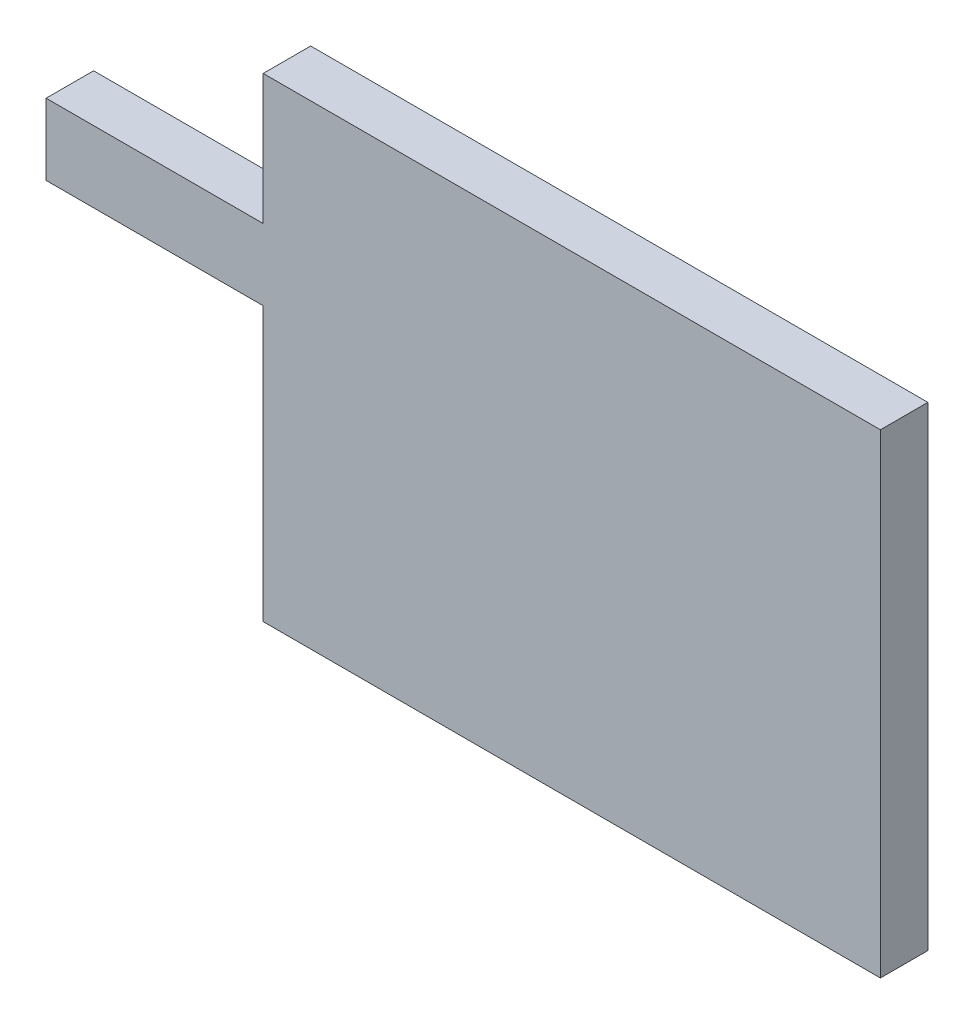
ISO-10303-21;
HEADER;
FILE_DESCRIPTION(('STEP AP214'),'2;1');
FILE_NAME('part.step','',(''),(''),'','','');
FILE_SCHEMA(('AUTOMOTIVE_DESIGN { 1 0 10303 214 1 1 1 1 }'));
ENDSEC;
DATA;
#1=APPLICATION_CONTEXT('core data for automotive mechanical design processes');
#2=APPLICATION_PROTOCOL_DEFINITION('international standard','automotive_design',2000,#1);
#3=PRODUCT_CONTEXT('',#1,'mechanical');
#4=PRODUCT('Part','Part','',(#3));
#5=PRODUCT_RELATED_PRODUCT_CATEGORY('part','',(#4));
#6=PRODUCT_DEFINITION_FORMATION('','',#4);
#7=PRODUCT_DEFINITION_CONTEXT('part definition',#1,'design');
#8=PRODUCT_DEFINITION('design','',#6,#7);
#9=PRODUCT_DEFINITION_SHAPE('','',#8);
#10=(LENGTH_UNIT() NAMED_UNIT(*) SI_UNIT(.MILLI.,.METRE.));
#11=(NAMED_UNIT(*) PLANE_ANGLE_UNIT() SI_UNIT($,.RADIAN.));
#12=(NAMED_UNIT(*) SI_UNIT($,.STERADIAN.) SOLID_ANGLE_UNIT());
#13=UNCERTAINTY_MEASURE_WITH_UNIT(LENGTH_MEASURE(1.E-05),#10,'distance_accuracy_value','');
#14=(GEOMETRIC_REPRESENTATION_CONTEXT(3) GLOBAL_UNCERTAINTY_ASSIGNED_CONTEXT((#13)) GLOBAL_UNIT_ASSIGNED_CONTEXT((#10,
#11,#12)) REPRESENTATION_CONTEXT('',''));
#15=CARTESIAN_POINT('',(0.,0.,0.));
#16=DIRECTION('',(0.,0.,1.));
#17=DIRECTION('',(1.,0.,0.));
#18=AXIS2_PLACEMENT_3D('',#15,#16,#17);
#19=CARTESIAN_POINT('',(-105.501188116584,45.1195608729233,10.));
#20=DIRECTION('',(1.,0.,0.));
#21=DIRECTION('',(0.,1.,0.));
#22=AXIS2_PLACEMENT_3D('',#19,#20,#21);
#23=PLANE('',#22);
#24=DIRECTION('',(0.,-1.,0.));
#25=VECTOR('',#24,1.);
#26=CARTESIAN_POINT('',(-105.501188116584,45.1195608729233,0.));
#27=LINE('',#26,#25);
#28=CARTESIAN_POINT('',(-105.501188116584,45.1195608729233,0.));
#29=VERTEX_POINT('',#28);
#30=CARTESIAN_POINT('',(-105.501188116584,17.7395608729233,0.));
#31=VERTEX_POINT('',#30);
#32=EDGE_CURVE('E129',#29,#31,#27,.T.);
#33=ORIENTED_EDGE('',*,*,#32,.T.);
#34=DIRECTION('',(0.,0.,-1.));
#35=VECTOR('',#34,1.);
#36=CARTESIAN_POINT('',(-105.501188116584,17.7395608729233,10.));
#37=LINE('',#36,#35);
#38=CARTESIAN_POINT('',(-105.501188116584,17.7395608729233,10.));
#39=VERTEX_POINT('',#38);
#40=EDGE_CURVE('E11',#39,#31,#37,.T.);
#41=ORIENTED_EDGE('',*,*,#40,.F.);
#42=DIRECTION('',(0.,-1.,0.));
#43=VECTOR('',#42,1.);
#44=CARTESIAN_POINT('',(-105.501188116584,45.1195608729233,10.));
#45=LINE('',#44,#43);
#46=CARTESIAN_POINT('',(-105.501188116584,45.1195608729233,10.));
#47=VERTEX_POINT('',#46);
#48=EDGE_CURVE('E143',#47,#39,#45,.T.);
#49=ORIENTED_EDGE('',*,*,#48,.F.);
#50=DIRECTION('',(0.,0.,-1.));
#51=VECTOR('',#50,1.);
#52=CARTESIAN_POINT('',(-105.501188116584,45.1195608729233,10.));
#53=LINE('',#52,#51);
#54=EDGE_CURVE('E125',#47,#29,#53,.T.);
#55=ORIENTED_EDGE('',*,*,#54,.T.);
#56=EDGE_LOOP('',(#33,#41,#49,#55));
#57=FACE_BOUND('',#56,.T.);
#58=ADVANCED_FACE('F33',(#57),#23,.F.);
#59=CARTESIAN_POINT('',(-151.221188116584,17.7395608729233,10.));
#60=DIRECTION('',(0.,-1.,0.));
#61=DIRECTION('',(0.,0.,-1.));
#62=AXIS2_PLACEMENT_3D('',#59,#60,#61);
#63=PLANE('',#62);
#64=DIRECTION('',(-1.,0.,0.));
#65=VECTOR('',#64,1.);
#66=CARTESIAN_POINT('',(-151.221188116584,17.7395608729233,0.));
#67=LINE('',#66,#65);
#68=CARTESIAN_POINT('',(-151.221188116584,17.7395608729233,0.));
#69=VERTEX_POINT('',#68);
#70=EDGE_CURVE('E132',#31,#69,#67,.T.);
#71=ORIENTED_EDGE('',*,*,#70,.T.);
#72=DIRECTION('',(0.,0.,-1.));
#73=VECTOR('',#72,1.);
#74=CARTESIAN_POINT('',(-151.221188116584,17.7395608729233,10.));
#75=LINE('',#74,#73);
#76=CARTESIAN_POINT('',(-151.221188116584,17.7395608729233,10.));
#77=VERTEX_POINT('',#76);
#78=EDGE_CURVE('E41',#77,#69,#75,.T.);
#79=ORIENTED_EDGE('',*,*,#78,.F.);
#80=DIRECTION('',(-1.,0.,0.));
#81=VECTOR('',#80,1.);
#82=CARTESIAN_POINT('',(-151.221188116584,17.7395608729233,10.));
#83=LINE('',#82,#81);
#84=EDGE_CURVE('E92',#39,#77,#83,.T.);
#85=ORIENTED_EDGE('',*,*,#84,.F.);
#86=ORIENTED_EDGE('',*,*,#40,.T.);
#87=EDGE_LOOP('',(#71,#79,#85,#86));
#88=FACE_BOUND('',#87,.T.);
#89=ADVANCED_FACE('F178',(#88),#63,.F.);
#90=CARTESIAN_POINT('',(-151.221188116584,17.7395608729233,10.));
#91=DIRECTION('',(1.,0.,0.));
#92=DIRECTION('',(0.,0.,-1.));
#93=AXIS2_PLACEMENT_3D('',#90,#91,#92);
#94=PLANE('',#93);
#95=DIRECTION('',(0.,-1.,0.));
#96=VECTOR('',#95,1.);
#97=CARTESIAN_POINT('',(-151.221188116584,17.7395608729233,0.));
#98=LINE('',#97,#96);
#99=CARTESIAN_POINT('',(-151.221188116584,2.73956087292333,0.));
#100=VERTEX_POINT('',#99);
#101=EDGE_CURVE('E134',#69,#100,#98,.T.);
#102=ORIENTED_EDGE('',*,*,#101,.T.);
#103=DIRECTION('',(0.,0.,-1.));
#104=VECTOR('',#103,1.);
#105=CARTESIAN_POINT('',(-151.221188116584,2.73956087292333,10.));
#106=LINE('',#105,#104);
#107=CARTESIAN_POINT('',(-151.221188116584,2.73956087292333,10.));
#108=VERTEX_POINT('',#107);
#109=EDGE_CURVE('E150',#108,#100,#106,.T.);
#110=ORIENTED_EDGE('',*,*,#109,.F.);
#111=DIRECTION('',(0.,-1.,0.));
#112=VECTOR('',#111,1.);
#113=CARTESIAN_POINT('',(-151.221188116584,17.7395608729233,10.));
#114=LINE('',#113,#112);
#115=EDGE_CURVE('E158',#77,#108,#114,.T.);
#116=ORIENTED_EDGE('',*,*,#115,.F.);
#117=ORIENTED_EDGE('',*,*,#78,.T.);
#118=EDGE_LOOP('',(#102,#110,#116,#117));
#119=FACE_BOUND('',#118,.T.);
#120=ADVANCED_FACE('F156',(#119),#94,.F.);
#121=CARTESIAN_POINT('',(-151.221188116584,2.73956087292333,10.));
#122=DIRECTION('',(0.,1.,0.));
#123=DIRECTION('',(0.,0.,1.));
#124=AXIS2_PLACEMENT_3D('',#121,#122,#123);
#125=PLANE('',#124);
#126=DIRECTION('',(1.,0.,0.));
#127=VECTOR('',#126,1.);
#128=CARTESIAN_POINT('',(-151.221188116584,2.73956087292333,0.));
#129=LINE('',#128,#127);
#130=CARTESIAN_POINT('',(-105.501188116584,2.73956087292333,0.));
#131=VERTEX_POINT('',#130);
#132=EDGE_CURVE('E136',#100,#131,#129,.T.);
#133=ORIENTED_EDGE('',*,*,#132,.T.);
#134=DIRECTION('',(0.,0.,-1.));
#135=VECTOR('',#134,1.);
#136=CARTESIAN_POINT('',(-105.501188116584,2.73956087292333,10.));
#137=LINE('',#136,#135);
#138=CARTESIAN_POINT('',(-105.501188116584,2.73956087292333,10.));
#139=VERTEX_POINT('',#138);
#140=EDGE_CURVE('E147',#139,#131,#137,.T.);
#141=ORIENTED_EDGE('',*,*,#140,.F.);
#142=DIRECTION('',(1.,0.,0.));
#143=VECTOR('',#142,1.);
#144=CARTESIAN_POINT('',(-151.221188116584,2.73956087292333,10.));
#145=LINE('',#144,#143);
#146=EDGE_CURVE('E170',#108,#139,#145,.T.);
#147=ORIENTED_EDGE('',*,*,#146,.F.);
#148=ORIENTED_EDGE('',*,*,#109,.T.);
#149=EDGE_LOOP('',(#133,#141,#147,#148));
#150=FACE_BOUND('',#149,.T.);
#151=ADVANCED_FACE('F166',(#150),#125,.F.);
#152=CARTESIAN_POINT('',(-105.501188116584,2.73956087292333,10.));
#153=DIRECTION('',(1.,0.,0.));
#154=DIRECTION('',(0.,1.,0.));
#155=AXIS2_PLACEMENT_3D('',#152,#153,#154);
#156=PLANE('',#155);
#157=DIRECTION('',(0.,-1.,0.));
#158=VECTOR('',#157,1.);
#159=CARTESIAN_POINT('',(-105.501188116584,2.73956087292333,0.));
#160=LINE('',#159,#158);
#161=CARTESIAN_POINT('',(-105.501188116584,-54.8804391270767,0.));
#162=VERTEX_POINT('',#161);
#163=EDGE_CURVE('E138',#131,#162,#160,.T.);
#164=ORIENTED_EDGE('',*,*,#163,.T.);
#165=DIRECTION('',(0.,0.,-1.));
#166=VECTOR('',#165,1.);
#167=CARTESIAN_POINT('',(-105.501188116584,-54.8804391270767,10.));
#168=LINE('',#167,#166);
#169=CARTESIAN_POINT('',(-105.501188116584,-54.8804391270767,10.));
#170=VERTEX_POINT('',#169);
#171=EDGE_CURVE('E120',#170,#162,#168,.T.);
#172=ORIENTED_EDGE('',*,*,#171,.F.);
#173=DIRECTION('',(0.,-1.,0.));
#174=VECTOR('',#173,1.);
#175=CARTESIAN_POINT('',(-105.501188116584,2.73956087292333,10.));
#176=LINE('',#175,#174);
#177=EDGE_CURVE('E111',#139,#170,#176,.T.);
#178=ORIENTED_EDGE('',*,*,#177,.F.);
#179=ORIENTED_EDGE('',*,*,#140,.T.);
#180=EDGE_LOOP('',(#164,#172,#178,#179));
#181=FACE_BOUND('',#180,.T.);
#182=ADVANCED_FACE('F169',(#181),#156,.F.);
#183=CARTESIAN_POINT('',(-105.501188116584,-54.8804391270767,10.));
#184=DIRECTION('',(0.,1.,0.));
#185=DIRECTION('',(0.,0.,1.));
#186=AXIS2_PLACEMENT_3D('',#183,#184,#185);
#187=PLANE('',#186);
#188=DIRECTION('',(1.,0.,0.));
#189=VECTOR('',#188,1.);
#190=CARTESIAN_POINT('',(-105.501188116584,-54.8804391270767,0.));
#191=LINE('',#190,#189);
#192=CARTESIAN_POINT('',(24.4988118834159,-54.8804391270767,0.));
#193=VERTEX_POINT('',#192);
#194=EDGE_CURVE('E119',#162,#193,#191,.T.);
#195=ORIENTED_EDGE('',*,*,#194,.T.);
#196=DIRECTION('',(0.,0.,-1.));
#197=VECTOR('',#196,1.);
#198=CARTESIAN_POINT('',(24.4988118834159,-54.8804391270767,10.));
#199=LINE('',#198,#197);
#200=CARTESIAN_POINT('',(24.4988118834159,-54.8804391270767,10.));
#201=VERTEX_POINT('',#200);
#202=EDGE_CURVE('E116',#201,#193,#199,.T.);
#203=ORIENTED_EDGE('',*,*,#202,.F.);
#204=DIRECTION('',(1.,0.,0.));
#205=VECTOR('',#204,1.);
#206=CARTESIAN_POINT('',(-105.501188116584,-54.8804391270767,10.));
#207=LINE('',#206,#205);
#208=EDGE_CURVE('E105',#170,#201,#207,.T.);
#209=ORIENTED_EDGE('',*,*,#208,.F.);
#210=ORIENTED_EDGE('',*,*,#171,.T.);
#211=EDGE_LOOP('',(#195,#203,#209,#210));
#212=FACE_BOUND('',#211,.T.);
#213=ADVANCED_FACE('F117',(#212),#187,.F.);
#214=CARTESIAN_POINT('',(24.4988118834158,45.1195608729234,10.));
#215=DIRECTION('',(-1.,0.,0.));
#216=DIRECTION('',(0.,-1.,0.));
#217=AXIS2_PLACEMENT_3D('',#214,#215,#216);
#218=PLANE('',#217);
#219=DIRECTION('',(0.,1.,0.));
#220=VECTOR('',#219,1.);
#221=CARTESIAN_POINT('',(24.4988118834158,45.1195608729234,0.));
#222=LINE('',#221,#220);
#223=CARTESIAN_POINT('',(24.4988118834158,45.1195608729234,0.));
#224=VERTEX_POINT('',#223);
#225=EDGE_CURVE('E78',#193,#224,#222,.T.);
#226=ORIENTED_EDGE('',*,*,#225,.T.);
#227=DIRECTION('',(0.,0.,-1.));
#228=VECTOR('',#227,1.);
#229=CARTESIAN_POINT('',(24.4988118834158,45.1195608729234,10.));
#230=LINE('',#229,#228);
#231=CARTESIAN_POINT('',(24.4988118834158,45.1195608729234,10.));
#232=VERTEX_POINT('',#231);
#233=EDGE_CURVE('E121',#232,#224,#230,.T.);
#234=ORIENTED_EDGE('',*,*,#233,.F.);
#235=DIRECTION('',(0.,1.,0.));
#236=VECTOR('',#235,1.);
#237=CARTESIAN_POINT('',(24.4988118834158,45.1195608729234,10.));
#238=LINE('',#237,#236);
#239=EDGE_CURVE('E109',#201,#232,#238,.T.);
#240=ORIENTED_EDGE('',*,*,#239,.F.);
#241=ORIENTED_EDGE('',*,*,#202,.T.);
#242=EDGE_LOOP('',(#226,#234,#240,#241));
#243=FACE_BOUND('',#242,.T.);
#244=ADVANCED_FACE('F123',(#243),#218,.F.);
#245=CARTESIAN_POINT('',(-105.501188116584,45.1195608729233,10.));
#246=DIRECTION('',(0.,-1.,0.));
#247=DIRECTION('',(1.,0.,0.));
#248=AXIS2_PLACEMENT_3D('',#245,#246,#247);
#249=PLANE('',#248);
#250=DIRECTION('',(-1.,0.,0.));
#251=VECTOR('',#250,1.);
#252=CARTESIAN_POINT('',(-105.501188116584,45.1195608729233,0.));
#253=LINE('',#252,#251);
#254=EDGE_CURVE('E84',#224,#29,#253,.T.);
#255=ORIENTED_EDGE('',*,*,#254,.T.);
#256=ORIENTED_EDGE('',*,*,#54,.F.);
#257=DIRECTION('',(-1.,0.,0.));
#258=VECTOR('',#257,1.);
#259=CARTESIAN_POINT('',(-105.501188116584,45.1195608729233,10.));
#260=LINE('',#259,#258);
#261=EDGE_CURVE('E49',#232,#47,#260,.T.);
#262=ORIENTED_EDGE('',*,*,#261,.F.);
#263=ORIENTED_EDGE('',*,*,#233,.T.);
#264=EDGE_LOOP('',(#255,#256,#262,#263));
#265=FACE_BOUND('',#264,.T.);
#266=ADVANCED_FACE('F194',(#265),#249,.F.);
#267=CARTESIAN_POINT('',(0.,0.,10.));
#268=DIRECTION('',(0.,0.,1.));
#269=DIRECTION('',(1.,0.,0.));
#270=AXIS2_PLACEMENT_3D('',#267,#268,#269);
#271=PLANE('',#270);
#272=ORIENTED_EDGE('',*,*,#48,.T.);
#273=ORIENTED_EDGE('',*,*,#84,.T.);
#274=ORIENTED_EDGE('',*,*,#115,.T.);
#275=ORIENTED_EDGE('',*,*,#146,.T.);
#276=ORIENTED_EDGE('',*,*,#177,.T.);
#277=ORIENTED_EDGE('',*,*,#208,.T.);
#278=ORIENTED_EDGE('',*,*,#239,.T.);
#279=ORIENTED_EDGE('',*,*,#261,.T.);
#280=EDGE_LOOP('',(#272,#273,#274,#275,#276,#277,#278,#279));
#281=FACE_BOUND('',#280,.T.);
#282=ADVANCED_FACE('F107',(#281),#271,.T.);
#283=CARTESIAN_POINT('',(0.,0.,0.));
#284=DIRECTION('',(0.,0.,1.));
#285=DIRECTION('',(1.,0.,0.));
#286=AXIS2_PLACEMENT_3D('',#283,#284,#285);
#287=PLANE('',#286);
#288=ORIENTED_EDGE('',*,*,#32,.F.);
#289=ORIENTED_EDGE('',*,*,#254,.F.);
#290=ORIENTED_EDGE('',*,*,#225,.F.);
#291=ORIENTED_EDGE('',*,*,#194,.F.);
#292=ORIENTED_EDGE('',*,*,#163,.F.);
#293=ORIENTED_EDGE('',*,*,#132,.F.);
#294=ORIENTED_EDGE('',*,*,#101,.F.);
#295=ORIENTED_EDGE('',*,*,#70,.F.);
#296=EDGE_LOOP('',(#288,#289,#290,#291,#292,#293,#294,#295));
#297=FACE_BOUND('',#296,.T.);
#298=ADVANCED_FACE('F162',(#297),#287,.F.);
#299=CLOSED_SHELL('',(#58,#89,#120,#151,#182,#213,#244,#266,#282,#298));
#300=MANIFOLD_SOLID_BREP('B2',#299);
#301=ADVANCED_BREP_SHAPE_REPRESENTATION('',(#18,#300),#14);
#302=SHAPE_DEFINITION_REPRESENTATION(#9,#301);
ENDSEC;
END-ISO-10303-21;
